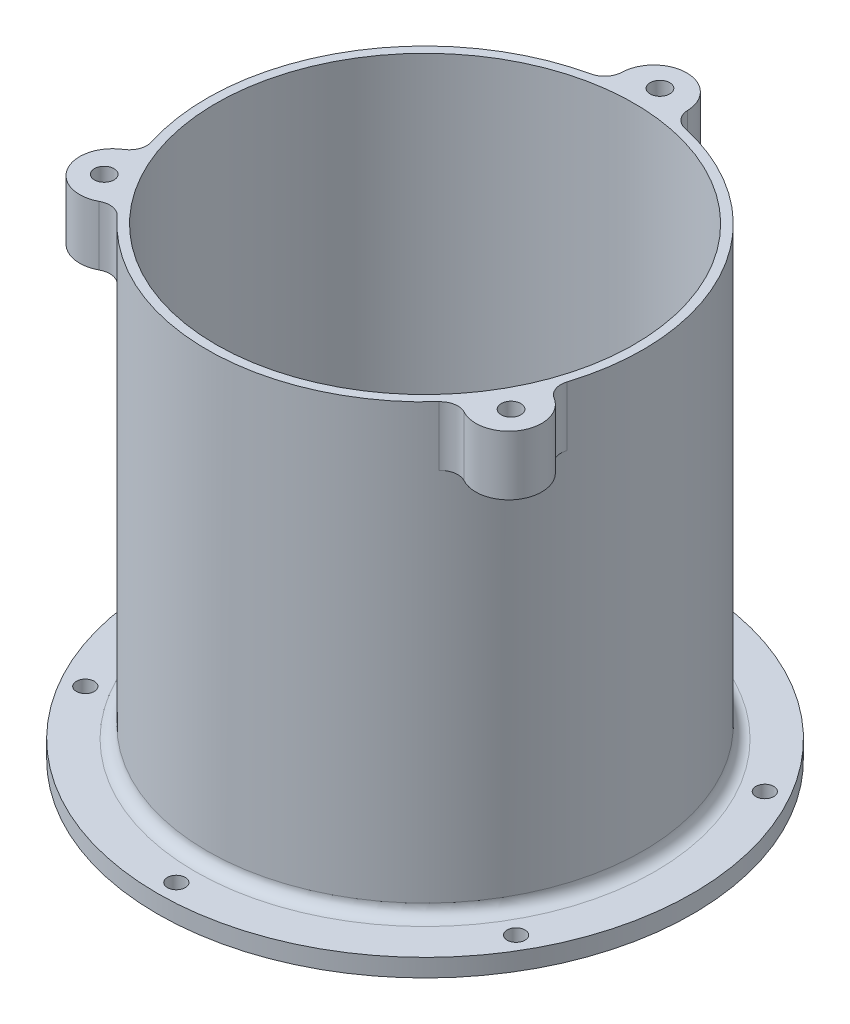
ISO-10303-21;
HEADER;
FILE_DESCRIPTION(('STEP AP214'),'2;1');
FILE_NAME('part.step','',(''),(''),'','','');
FILE_SCHEMA(('AUTOMOTIVE_DESIGN { 1 0 10303 214 1 1 1 1 }'));
ENDSEC;
DATA;
#1=APPLICATION_CONTEXT('core data for automotive mechanical design processes');
#2=APPLICATION_PROTOCOL_DEFINITION('international standard','automotive_design',2000,#1);
#3=PRODUCT_CONTEXT('',#1,'mechanical');
#4=PRODUCT('Part','Part','',(#3));
#5=PRODUCT_RELATED_PRODUCT_CATEGORY('part','',(#4));
#6=PRODUCT_DEFINITION_FORMATION('','',#4);
#7=PRODUCT_DEFINITION_CONTEXT('part definition',#1,'design');
#8=PRODUCT_DEFINITION('design','',#6,#7);
#9=PRODUCT_DEFINITION_SHAPE('','',#8);
#10=(LENGTH_UNIT() NAMED_UNIT(*) SI_UNIT(.MILLI.,.METRE.));
#11=(NAMED_UNIT(*) PLANE_ANGLE_UNIT() SI_UNIT($,.RADIAN.));
#12=(NAMED_UNIT(*) SI_UNIT($,.STERADIAN.) SOLID_ANGLE_UNIT());
#13=UNCERTAINTY_MEASURE_WITH_UNIT(LENGTH_MEASURE(1.E-05),#10,'distance_accuracy_value','');
#14=(GEOMETRIC_REPRESENTATION_CONTEXT(3) GLOBAL_UNCERTAINTY_ASSIGNED_CONTEXT((#13)) GLOBAL_UNIT_ASSIGNED_CONTEXT((#10,
#11,#12)) REPRESENTATION_CONTEXT('',''));
#15=CARTESIAN_POINT('',(0.,0.,0.));
#16=DIRECTION('',(0.,0.,1.));
#17=DIRECTION('',(1.,0.,0.));
#18=AXIS2_PLACEMENT_3D('',#15,#16,#17);
#19=CARTESIAN_POINT('',(0.,78.,0.));
#20=DIRECTION('',(0.,-1.,0.));
#21=DIRECTION('',(0.,0.,-1.));
#22=AXIS2_PLACEMENT_3D('',#19,#20,#21);
#23=CYLINDRICAL_SURFACE('',#22,36.65);
#24=CARTESIAN_POINT('',(0.,5.,0.));
#25=DIRECTION('',(0.,1.,0.));
#26=DIRECTION('',(0.,0.,1.));
#27=AXIS2_PLACEMENT_3D('',#24,#25,#26);
#28=CIRCLE('',#27,36.65);
#29=CARTESIAN_POINT('',(0.,5.,36.65));
#30=VERTEX_POINT('',#29);
#31=EDGE_CURVE('E264',#30,#30,#28,.T.);
#32=ORIENTED_EDGE('',*,*,#31,.T.);
#33=EDGE_LOOP('',(#32));
#34=FACE_BOUND('',#33,.T.);
#35=CARTESIAN_POINT('',(0.,78.,0.));
#36=DIRECTION('',(0.,1.,0.));
#37=DIRECTION('',(0.,0.,1.));
#38=AXIS2_PLACEMENT_3D('',#35,#36,#37);
#39=CIRCLE('',#38,36.65);
#40=CARTESIAN_POINT('',(-7.89335976646149,78.,-35.789906001514));
#41=VERTEX_POINT('',#40);
#42=CARTESIAN_POINT('',(-34.9416476795991,78.,11.059102921791));
#43=VERTEX_POINT('',#42);
#44=EDGE_CURVE('E254',#41,#43,#39,.T.);
#45=ORIENTED_EDGE('',*,*,#44,.F.);
#46=DIRECTION('',(0.,-1.,0.));
#47=VECTOR('',#46,1.);
#48=CARTESIAN_POINT('',(-7.89335976646149,78.,-35.789906001514));
#49=LINE('',#48,#47);
#50=CARTESIAN_POINT('',(-7.89335976646149,68.,-35.789906001514));
#51=VERTEX_POINT('',#50);
#52=EDGE_CURVE('E167',#41,#51,#49,.T.);
#53=ORIENTED_EDGE('',*,*,#52,.T.);
#54=CARTESIAN_POINT('',(0.,68.,0.));
#55=DIRECTION('',(0.,1.,0.));
#56=DIRECTION('',(0.,0.,1.));
#57=AXIS2_PLACEMENT_3D('',#54,#55,#56);
#58=CIRCLE('',#57,36.65);
#59=CARTESIAN_POINT('',(7.89335976646148,68.,-35.789906001514));
#60=VERTEX_POINT('',#59);
#61=EDGE_CURVE('E195',#60,#51,#58,.T.);
#62=ORIENTED_EDGE('',*,*,#61,.F.);
#63=DIRECTION('',(0.,-1.,0.));
#64=VECTOR('',#63,1.);
#65=CARTESIAN_POINT('',(7.89335976646148,78.,-35.789906001514));
#66=LINE('',#65,#64);
#67=CARTESIAN_POINT('',(7.89335976646148,78.,-35.789906001514));
#68=VERTEX_POINT('',#67);
#69=EDGE_CURVE('E281',#60,#68,#66,.F.);
#70=ORIENTED_EDGE('',*,*,#69,.T.);
#71=CARTESIAN_POINT('',(34.941647679599,78.,11.0591029217915));
#72=VERTEX_POINT('',#71);
#73=EDGE_CURVE('E256',#72,#68,#39,.T.);
#74=ORIENTED_EDGE('',*,*,#73,.F.);
#75=DIRECTION('',(0.,-1.,0.));
#76=VECTOR('',#75,1.);
#77=CARTESIAN_POINT('',(34.941647679599,78.,11.0591029217915));
#78=LINE('',#77,#76);
#79=CARTESIAN_POINT('',(34.941647679599,68.,11.0591029217915));
#80=VERTEX_POINT('',#79);
#81=EDGE_CURVE('E284',#72,#80,#78,.T.);
#82=ORIENTED_EDGE('',*,*,#81,.T.);
#83=CARTESIAN_POINT('',(0.,68.,0.));
#84=DIRECTION('',(0.,1.,0.));
#85=DIRECTION('',(0.,0.,1.));
#86=AXIS2_PLACEMENT_3D('',#83,#84,#85);
#87=CIRCLE('',#86,36.65);
#88=CARTESIAN_POINT('',(27.0482879131374,68.,24.7308030797228));
#89=VERTEX_POINT('',#88);
#90=EDGE_CURVE('E207',#89,#80,#87,.T.);
#91=ORIENTED_EDGE('',*,*,#90,.F.);
#92=DIRECTION('',(0.,-1.,0.));
#93=VECTOR('',#92,1.);
#94=CARTESIAN_POINT('',(27.0482879131374,78.,24.7308030797228));
#95=LINE('',#94,#93);
#96=CARTESIAN_POINT('',(27.0482879131374,78.,24.7308030797228));
#97=VERTEX_POINT('',#96);
#98=EDGE_CURVE('E275',#89,#97,#95,.F.);
#99=ORIENTED_EDGE('',*,*,#98,.T.);
#100=CARTESIAN_POINT('',(-27.0482879131377,78.,24.7308030797224));
#101=VERTEX_POINT('',#100);
#102=EDGE_CURVE('E253',#101,#97,#39,.T.);
#103=ORIENTED_EDGE('',*,*,#102,.F.);
#104=DIRECTION('',(0.,-1.,0.));
#105=VECTOR('',#104,1.);
#106=CARTESIAN_POINT('',(-27.0482879131377,78.,24.7308030797224));
#107=LINE('',#106,#105);
#108=CARTESIAN_POINT('',(-27.0482879131377,68.,24.7308030797224));
#109=VERTEX_POINT('',#108);
#110=EDGE_CURVE('E278',#101,#109,#107,.T.);
#111=ORIENTED_EDGE('',*,*,#110,.T.);
#112=CARTESIAN_POINT('',(0.,68.,0.));
#113=DIRECTION('',(0.,1.,0.));
#114=DIRECTION('',(0.,0.,1.));
#115=AXIS2_PLACEMENT_3D('',#112,#113,#114);
#116=CIRCLE('',#115,36.65);
#117=CARTESIAN_POINT('',(-34.9416476795991,68.,11.059102921791));
#118=VERTEX_POINT('',#117);
#119=EDGE_CURVE('E191',#118,#109,#116,.T.);
#120=ORIENTED_EDGE('',*,*,#119,.F.);
#121=DIRECTION('',(0.,-1.,0.));
#122=VECTOR('',#121,1.);
#123=CARTESIAN_POINT('',(-34.9416476795991,78.,11.059102921791));
#124=LINE('',#123,#122);
#125=EDGE_CURVE('E183',#118,#43,#124,.F.);
#126=ORIENTED_EDGE('',*,*,#125,.T.);
#127=EDGE_LOOP('',(#45,#53,#62,#70,#74,#82,#91,#99,#103,#111,#120,#126));
#128=FACE_BOUND('',#127,.T.);
#129=ADVANCED_FACE('F71',(#34,#128),#23,.T.);
#130=CARTESIAN_POINT('',(0.,3.,0.));
#131=DIRECTION('',(0.,1.,0.));
#132=DIRECTION('',(0.,0.,1.));
#133=AXIS2_PLACEMENT_3D('',#130,#131,#132);
#134=PLANE('',#133);
#135=CARTESIAN_POINT('',(0.,3.,-41.825));
#136=DIRECTION('',(0.,1.,0.));
#137=DIRECTION('',(0.,0.,1.));
#138=AXIS2_PLACEMENT_3D('',#135,#136,#137);
#139=CIRCLE('',#138,1.5);
#140=CARTESIAN_POINT('',(0.,3.,-40.325));
#141=VERTEX_POINT('',#140);
#142=EDGE_CURVE('E219',#141,#141,#139,.T.);
#143=ORIENTED_EDGE('',*,*,#142,.F.);
#144=EDGE_LOOP('',(#143));
#145=FACE_BOUND('',#144,.T.);
#146=CARTESIAN_POINT('',(-36.221512513283,3.,-20.9124999999979));
#147=DIRECTION('',(0.,1.,0.));
#148=DIRECTION('',(0.,0.,1.));
#149=AXIS2_PLACEMENT_3D('',#146,#147,#148);
#150=CIRCLE('',#149,1.50000000000223);
#151=CARTESIAN_POINT('',(-36.221512513283,3.,-19.4124999999957));
#152=VERTEX_POINT('',#151);
#153=EDGE_CURVE('E209',#152,#152,#150,.T.);
#154=ORIENTED_EDGE('',*,*,#153,.F.);
#155=EDGE_LOOP('',(#154));
#156=FACE_BOUND('',#155,.T.);
#157=CARTESIAN_POINT('',(-36.2215125132806,3.,20.9125000000021));
#158=DIRECTION('',(0.,1.,0.));
#159=DIRECTION('',(0.,0.,1.));
#160=AXIS2_PLACEMENT_3D('',#157,#158,#159);
#161=CIRCLE('',#160,1.50000000000439);
#162=CARTESIAN_POINT('',(-36.2215125132806,3.,22.4125000000065));
#163=VERTEX_POINT('',#162);
#164=EDGE_CURVE('E226',#163,#163,#161,.T.);
#165=ORIENTED_EDGE('',*,*,#164,.F.);
#166=EDGE_LOOP('',(#165));
#167=FACE_BOUND('',#166,.T.);
#168=CARTESIAN_POINT('',(4.74470781723172E-12,3.,41.825));
#169=DIRECTION('',(0.,1.,0.));
#170=DIRECTION('',(0.,0.,1.));
#171=AXIS2_PLACEMENT_3D('',#168,#169,#170);
#172=CIRCLE('',#171,1.50000000000482);
#173=CARTESIAN_POINT('',(4.74470781723172E-12,3.,43.3250000000048));
#174=VERTEX_POINT('',#173);
#175=EDGE_CURVE('E243',#174,#174,#172,.T.);
#176=ORIENTED_EDGE('',*,*,#175,.F.);
#177=EDGE_LOOP('',(#176));
#178=FACE_BOUND('',#177,.T.);
#179=CARTESIAN_POINT('',(36.2215125132877,3.,20.9124999999979));
#180=DIRECTION('',(0.,1.,0.));
#181=DIRECTION('',(0.,0.,1.));
#182=AXIS2_PLACEMENT_3D('',#179,#180,#181);
#183=CIRCLE('',#182,1.50000000000301);
#184=CARTESIAN_POINT('',(36.2215125132877,3.,22.4125000000009));
#185=VERTEX_POINT('',#184);
#186=EDGE_CURVE('E237',#185,#185,#183,.T.);
#187=ORIENTED_EDGE('',*,*,#186,.F.);
#188=EDGE_LOOP('',(#187));
#189=FACE_BOUND('',#188,.T.);
#190=CARTESIAN_POINT('',(36.2215125132853,3.,-20.9125000000021));
#191=DIRECTION('',(0.,1.,0.));
#192=DIRECTION('',(0.,0.,1.));
#193=AXIS2_PLACEMENT_3D('',#190,#191,#192);
#194=CIRCLE('',#193,1.50000000000063);
#195=CARTESIAN_POINT('',(36.2215125132853,3.,-19.4125000000014));
#196=VERTEX_POINT('',#195);
#197=EDGE_CURVE('E231',#196,#196,#194,.T.);
#198=ORIENTED_EDGE('',*,*,#197,.F.);
#199=EDGE_LOOP('',(#198));
#200=FACE_BOUND('',#199,.T.);
#201=CARTESIAN_POINT('',(0.,3.,0.));
#202=DIRECTION('',(0.,1.,0.));
#203=DIRECTION('',(0.,0.,1.));
#204=AXIS2_PLACEMENT_3D('',#201,#202,#203);
#205=CIRCLE('',#204,38.65);
#206=CARTESIAN_POINT('',(0.,3.,38.65));
#207=VERTEX_POINT('',#206);
#208=EDGE_CURVE('E269',#207,#207,#205,.F.);
#209=ORIENTED_EDGE('',*,*,#208,.T.);
#210=EDGE_LOOP('',(#209));
#211=FACE_BOUND('',#210,.T.);
#212=CARTESIAN_POINT('',(0.,3.,0.));
#213=DIRECTION('',(0.,1.,0.));
#214=DIRECTION('',(0.,0.,1.));
#215=AXIS2_PLACEMENT_3D('',#212,#213,#214);
#216=CIRCLE('',#215,45.);
#217=CARTESIAN_POINT('',(0.,3.,45.));
#218=VERTEX_POINT('',#217);
#219=EDGE_CURVE('E261',#218,#218,#216,.T.);
#220=ORIENTED_EDGE('',*,*,#219,.T.);
#221=EDGE_LOOP('',(#220));
#222=FACE_BOUND('',#221,.T.);
#223=ADVANCED_FACE('F350',(#145,#156,#167,#178,#189,#200,#211,#222),#134,.T.);
#224=CARTESIAN_POINT('',(0.,0.,0.));
#225=DIRECTION('',(0.,1.,0.));
#226=DIRECTION('',(0.,0.,1.));
#227=AXIS2_PLACEMENT_3D('',#224,#225,#226);
#228=PLANE('',#227);
#229=CARTESIAN_POINT('',(0.,0.,-41.825));
#230=DIRECTION('',(0.,1.,0.));
#231=DIRECTION('',(0.,0.,1.));
#232=AXIS2_PLACEMENT_3D('',#229,#230,#231);
#233=CIRCLE('',#232,1.5);
#234=CARTESIAN_POINT('',(0.,0.,-40.325));
#235=VERTEX_POINT('',#234);
#236=EDGE_CURVE('E215',#235,#235,#233,.T.);
#237=ORIENTED_EDGE('',*,*,#236,.T.);
#238=EDGE_LOOP('',(#237));
#239=FACE_BOUND('',#238,.T.);
#240=CARTESIAN_POINT('',(-36.221512513283,0.,-20.9124999999979));
#241=DIRECTION('',(0.,1.,0.));
#242=DIRECTION('',(0.,0.,1.));
#243=AXIS2_PLACEMENT_3D('',#240,#241,#242);
#244=CIRCLE('',#243,1.50000000000223);
#245=CARTESIAN_POINT('',(-36.221512513283,0.,-19.4124999999957));
#246=VERTEX_POINT('',#245);
#247=EDGE_CURVE('E223',#246,#246,#244,.T.);
#248=ORIENTED_EDGE('',*,*,#247,.T.);
#249=EDGE_LOOP('',(#248));
#250=FACE_BOUND('',#249,.T.);
#251=CARTESIAN_POINT('',(-36.2215125132806,0.,20.9125000000021));
#252=DIRECTION('',(0.,1.,0.));
#253=DIRECTION('',(0.,0.,1.));
#254=AXIS2_PLACEMENT_3D('',#251,#252,#253);
#255=CIRCLE('',#254,1.50000000000439);
#256=CARTESIAN_POINT('',(-36.2215125132806,0.,22.4125000000065));
#257=VERTEX_POINT('',#256);
#258=EDGE_CURVE('E246',#257,#257,#255,.T.);
#259=ORIENTED_EDGE('',*,*,#258,.T.);
#260=EDGE_LOOP('',(#259));
#261=FACE_BOUND('',#260,.T.);
#262=CARTESIAN_POINT('',(4.74470781723172E-12,0.,41.825));
#263=DIRECTION('',(0.,1.,0.));
#264=DIRECTION('',(0.,0.,1.));
#265=AXIS2_PLACEMENT_3D('',#262,#263,#264);
#266=CIRCLE('',#265,1.50000000000482);
#267=CARTESIAN_POINT('',(4.74470781723172E-12,0.,43.3250000000048));
#268=VERTEX_POINT('',#267);
#269=EDGE_CURVE('E240',#268,#268,#266,.T.);
#270=ORIENTED_EDGE('',*,*,#269,.T.);
#271=EDGE_LOOP('',(#270));
#272=FACE_BOUND('',#271,.T.);
#273=CARTESIAN_POINT('',(36.2215125132877,0.,20.9124999999979));
#274=DIRECTION('',(0.,1.,0.));
#275=DIRECTION('',(0.,0.,1.));
#276=AXIS2_PLACEMENT_3D('',#273,#274,#275);
#277=CIRCLE('',#276,1.50000000000301);
#278=CARTESIAN_POINT('',(36.2215125132877,0.,22.4125000000009));
#279=VERTEX_POINT('',#278);
#280=EDGE_CURVE('E234',#279,#279,#277,.T.);
#281=ORIENTED_EDGE('',*,*,#280,.T.);
#282=EDGE_LOOP('',(#281));
#283=FACE_BOUND('',#282,.T.);
#284=CARTESIAN_POINT('',(36.2215125132853,0.,-20.9125000000021));
#285=DIRECTION('',(0.,1.,0.));
#286=DIRECTION('',(0.,0.,1.));
#287=AXIS2_PLACEMENT_3D('',#284,#285,#286);
#288=CIRCLE('',#287,1.50000000000063);
#289=CARTESIAN_POINT('',(36.2215125132853,0.,-19.4125000000014));
#290=VERTEX_POINT('',#289);
#291=EDGE_CURVE('E222',#290,#290,#288,.T.);
#292=ORIENTED_EDGE('',*,*,#291,.T.);
#293=EDGE_LOOP('',(#292));
#294=FACE_BOUND('',#293,.T.);
#295=CARTESIAN_POINT('',(0.,0.,0.));
#296=DIRECTION('',(0.,1.,0.));
#297=DIRECTION('',(0.,0.,1.));
#298=AXIS2_PLACEMENT_3D('',#295,#296,#297);
#299=CIRCLE('',#298,45.);
#300=CARTESIAN_POINT('',(0.,0.,45.));
#301=VERTEX_POINT('',#300);
#302=EDGE_CURVE('E260',#301,#301,#299,.T.);
#303=ORIENTED_EDGE('',*,*,#302,.F.);
#304=EDGE_LOOP('',(#303));
#305=FACE_BOUND('',#304,.T.);
#306=CARTESIAN_POINT('',(0.,0.,0.));
#307=DIRECTION('',(0.,1.,0.));
#308=DIRECTION('',(0.,0.,1.));
#309=AXIS2_PLACEMENT_3D('',#306,#307,#308);
#310=CIRCLE('',#309,35.15);
#311=CARTESIAN_POINT('',(0.,0.,35.15));
#312=VERTEX_POINT('',#311);
#313=EDGE_CURVE('E257',#312,#312,#310,.T.);
#314=ORIENTED_EDGE('',*,*,#313,.T.);
#315=EDGE_LOOP('',(#314));
#316=FACE_BOUND('',#315,.T.);
#317=ADVANCED_FACE('F358',(#239,#250,#261,#272,#283,#294,#305,#316),#228,.F.);
#318=CARTESIAN_POINT('',(0.,3.,0.));
#319=DIRECTION('',(0.,-1.,0.));
#320=DIRECTION('',(0.,0.,-1.));
#321=AXIS2_PLACEMENT_3D('',#318,#319,#320);
#322=CYLINDRICAL_SURFACE('',#321,45.);
#323=ORIENTED_EDGE('',*,*,#219,.F.);
#324=EDGE_LOOP('',(#323));
#325=FACE_BOUND('',#324,.T.);
#326=ORIENTED_EDGE('',*,*,#302,.T.);
#327=EDGE_LOOP('',(#326));
#328=FACE_BOUND('',#327,.T.);
#329=ADVANCED_FACE('F366',(#325,#328),#322,.T.);
#330=CARTESIAN_POINT('',(0.,3.,0.));
#331=DIRECTION('',(0.,-1.,0.));
#332=DIRECTION('',(0.,0.,-1.));
#333=AXIS2_PLACEMENT_3D('',#330,#331,#332);
#334=CYLINDRICAL_SURFACE('',#333,35.15);
#335=ORIENTED_EDGE('',*,*,#313,.F.);
#336=EDGE_LOOP('',(#335));
#337=FACE_BOUND('',#336,.T.);
#338=CARTESIAN_POINT('',(0.,78.,0.));
#339=DIRECTION('',(0.,1.,0.));
#340=DIRECTION('',(0.,0.,1.));
#341=AXIS2_PLACEMENT_3D('',#338,#339,#340);
#342=CIRCLE('',#341,35.15);
#343=CARTESIAN_POINT('',(0.,78.,35.15));
#344=VERTEX_POINT('',#343);
#345=EDGE_CURVE('E218',#344,#344,#342,.T.);
#346=ORIENTED_EDGE('',*,*,#345,.T.);
#347=EDGE_LOOP('',(#346));
#348=FACE_BOUND('',#347,.T.);
#349=ADVANCED_FACE('F364',(#337,#348),#334,.F.);
#350=CARTESIAN_POINT('',(0.,78.,0.));
#351=DIRECTION('',(0.,1.,0.));
#352=DIRECTION('',(0.,0.,1.));
#353=AXIS2_PLACEMENT_3D('',#350,#351,#352);
#354=PLANE('',#353);
#355=CARTESIAN_POINT('',(0.,78.,-39.5));
#356=DIRECTION('',(0.,1.,0.));
#357=DIRECTION('',(0.,0.,1.));
#358=AXIS2_PLACEMENT_3D('',#355,#356,#357);
#359=CIRCLE('',#358,1.65);
#360=CARTESIAN_POINT('',(0.,78.,-37.85));
#361=VERTEX_POINT('',#360);
#362=EDGE_CURVE('E463',#361,#361,#359,.T.);
#363=ORIENTED_EDGE('',*,*,#362,.F.);
#364=EDGE_LOOP('',(#363));
#365=FACE_BOUND('',#364,.T.);
#366=CARTESIAN_POINT('',(34.2080034494869,78.,19.7499999999991));
#367=DIRECTION('',(0.,1.,0.));
#368=DIRECTION('',(0.,0.,1.));
#369=AXIS2_PLACEMENT_3D('',#366,#367,#368);
#370=CIRCLE('',#369,1.65);
#371=CARTESIAN_POINT('',(34.2080034494869,78.,21.3999999999991));
#372=VERTEX_POINT('',#371);
#373=EDGE_CURVE('E467',#372,#372,#370,.T.);
#374=ORIENTED_EDGE('',*,*,#373,.F.);
#375=EDGE_LOOP('',(#374));
#376=FACE_BOUND('',#375,.T.);
#377=CARTESIAN_POINT('',(-34.2080034494837,78.,19.7500000000009));
#378=DIRECTION('',(0.,1.,0.));
#379=DIRECTION('',(0.,0.,1.));
#380=AXIS2_PLACEMENT_3D('',#377,#378,#379);
#381=CIRCLE('',#380,1.65);
#382=CARTESIAN_POINT('',(-34.2080034494837,78.,21.4000000000009));
#383=VERTEX_POINT('',#382);
#384=EDGE_CURVE('E198',#383,#383,#381,.T.);
#385=ORIENTED_EDGE('',*,*,#384,.F.);
#386=EDGE_LOOP('',(#385));
#387=FACE_BOUND('',#386,.T.);
#388=CARTESIAN_POINT('',(33.3106548429465,78.,19.2319155404581));
#389=DIRECTION('',(0.,-1.,0.));
#390=DIRECTION('',(0.,0.,-1.));
#391=AXIS2_PLACEMENT_3D('',#388,#389,#390);
#392=CIRCLE('',#391,5.54330034178372);
#393=CARTESIAN_POINT('',(36.2247302017688,78.,14.5163727846001));
#394=VERTEX_POINT('',#393);
#395=CARTESIAN_POINT('',(30.683912703153,78.,24.1133502076694));
#396=VERTEX_POINT('',#395);
#397=EDGE_CURVE('E205',#394,#396,#392,.T.);
#398=ORIENTED_EDGE('',*,*,#397,.F.);
#399=CARTESIAN_POINT('',(37.8018098361828,78.,11.9643500913788));
#400=DIRECTION('',(0.,1.,0.));
#401=DIRECTION('',(0.,0.,1.));
#402=AXIS2_PLACEMENT_3D('',#399,#400,#401);
#403=CIRCLE('',#402,3.);
#404=EDGE_CURVE('E297',#394,#72,#403,.F.);
#405=ORIENTED_EDGE('',*,*,#404,.T.);
#406=ORIENTED_EDGE('',*,*,#73,.T.);
#407=CARTESIAN_POINT('',(8.53947379918684,78.,-38.7195026728521));
#408=DIRECTION('',(0.,1.,0.));
#409=DIRECTION('',(0.,0.,1.));
#410=AXIS2_PLACEMENT_3D('',#407,#408,#409);
#411=CIRCLE('',#410,3.);
#412=CARTESIAN_POINT('',(5.5408174986158,78.,-38.6297229922692));
#413=VERTEX_POINT('',#412);
#414=EDGE_CURVE('E190',#68,#413,#411,.F.);
#415=ORIENTED_EDGE('',*,*,#414,.T.);
#416=CARTESIAN_POINT('',(0.,78.,-38.4638310809158));
#417=DIRECTION('',(0.,-1.,0.));
#418=DIRECTION('',(0.,0.,-1.));
#419=AXIS2_PLACEMENT_3D('',#416,#417,#418);
#420=CIRCLE('',#419,5.54330034178372);
#421=CARTESIAN_POINT('',(-5.5408174986158,78.,-38.6297229922692));
#422=VERTEX_POINT('',#421);
#423=EDGE_CURVE('E179',#422,#413,#420,.T.);
#424=ORIENTED_EDGE('',*,*,#423,.F.);
#425=CARTESIAN_POINT('',(-8.53947379918685,78.,-38.7195026728521));
#426=DIRECTION('',(0.,1.,0.));
#427=DIRECTION('',(0.,0.,1.));
#428=AXIS2_PLACEMENT_3D('',#425,#426,#427);
#429=CIRCLE('',#428,3.);
#430=EDGE_CURVE('E161',#422,#41,#429,.F.);
#431=ORIENTED_EDGE('',*,*,#430,.T.);
#432=ORIENTED_EDGE('',*,*,#44,.T.);
#433=CARTESIAN_POINT('',(-37.8018098361829,78.,11.9643500913783));
#434=DIRECTION('',(0.,1.,0.));
#435=DIRECTION('',(0.,0.,1.));
#436=AXIS2_PLACEMENT_3D('',#433,#434,#435);
#437=CIRCLE('',#436,3.);
#438=CARTESIAN_POINT('',(-36.224730201769,78.,14.5163727845997));
#439=VERTEX_POINT('',#438);
#440=EDGE_CURVE('E79',#43,#439,#437,.F.);
#441=ORIENTED_EDGE('',*,*,#440,.T.);
#442=CARTESIAN_POINT('',(-33.3106548429467,78.,19.2319155404576));
#443=DIRECTION('',(0.,-1.,0.));
#444=DIRECTION('',(0.,0.,-1.));
#445=AXIS2_PLACEMENT_3D('',#442,#443,#444);
#446=CIRCLE('',#445,5.54330034178372);
#447=CARTESIAN_POINT('',(-30.6839127031533,78.,24.113350207669));
#448=VERTEX_POINT('',#447);
#449=EDGE_CURVE('E203',#448,#439,#446,.T.);
#450=ORIENTED_EDGE('',*,*,#449,.F.);
#451=CARTESIAN_POINT('',(-29.2623360369962,78.,26.7551525814732));
#452=DIRECTION('',(0.,1.,0.));
#453=DIRECTION('',(0.,0.,1.));
#454=AXIS2_PLACEMENT_3D('',#451,#452,#453);
#455=CIRCLE('',#454,3.);
#456=EDGE_CURVE('E305',#448,#101,#455,.F.);
#457=ORIENTED_EDGE('',*,*,#456,.T.);
#458=ORIENTED_EDGE('',*,*,#102,.T.);
#459=CARTESIAN_POINT('',(29.2623360369959,78.,26.7551525814736));
#460=DIRECTION('',(0.,1.,0.));
#461=DIRECTION('',(0.,0.,1.));
#462=AXIS2_PLACEMENT_3D('',#459,#460,#461);
#463=CIRCLE('',#462,3.);
#464=EDGE_CURVE('E308',#97,#396,#463,.F.);
#465=ORIENTED_EDGE('',*,*,#464,.T.);
#466=EDGE_LOOP('',(#398,#405,#406,#415,#424,#431,#432,#441,#450,#457,#458,#465));
#467=FACE_BOUND('',#466,.T.);
#468=ORIENTED_EDGE('',*,*,#345,.F.);
#469=EDGE_LOOP('',(#468));
#470=FACE_BOUND('',#469,.T.);
#471=ADVANCED_FACE('F187',(#365,#376,#387,#467,#470),#354,.T.);
#472=CARTESIAN_POINT('',(0.,5.,0.));
#473=DIRECTION('',(0.,1.,0.));
#474=DIRECTION('',(0.,0.,1.));
#475=AXIS2_PLACEMENT_3D('',#472,#473,#474);
#476=TOROIDAL_SURFACE('',#475,38.65,2.);
#477=ORIENTED_EDGE('',*,*,#208,.F.);
#478=EDGE_LOOP('',(#477));
#479=FACE_BOUND('',#478,.T.);
#480=ORIENTED_EDGE('',*,*,#31,.F.);
#481=EDGE_LOOP('',(#480));
#482=FACE_BOUND('',#481,.T.);
#483=ADVANCED_FACE('F375',(#479,#482),#476,.F.);
#484=CARTESIAN_POINT('',(36.2215125132853,0.,-20.9125000000021));
#485=DIRECTION('',(0.,1.,0.));
#486=DIRECTION('',(0.,0.,1.));
#487=AXIS2_PLACEMENT_3D('',#484,#485,#486);
#488=CYLINDRICAL_SURFACE('',#487,1.50000000000063);
#489=ORIENTED_EDGE('',*,*,#291,.F.);
#490=EDGE_LOOP('',(#489));
#491=FACE_BOUND('',#490,.T.);
#492=ORIENTED_EDGE('',*,*,#197,.T.);
#493=EDGE_LOOP('',(#492));
#494=FACE_BOUND('',#493,.T.);
#495=ADVANCED_FACE('F378',(#491,#494),#488,.F.);
#496=CARTESIAN_POINT('',(36.2215125132877,0.,20.9124999999979));
#497=DIRECTION('',(0.,1.,0.));
#498=DIRECTION('',(0.,0.,1.));
#499=AXIS2_PLACEMENT_3D('',#496,#497,#498);
#500=CYLINDRICAL_SURFACE('',#499,1.50000000000301);
#501=ORIENTED_EDGE('',*,*,#280,.F.);
#502=EDGE_LOOP('',(#501));
#503=FACE_BOUND('',#502,.T.);
#504=ORIENTED_EDGE('',*,*,#186,.T.);
#505=EDGE_LOOP('',(#504));
#506=FACE_BOUND('',#505,.T.);
#507=ADVANCED_FACE('F424',(#503,#506),#500,.F.);
#508=CARTESIAN_POINT('',(4.74470781723172E-12,0.,41.825));
#509=DIRECTION('',(0.,1.,0.));
#510=DIRECTION('',(0.,0.,1.));
#511=AXIS2_PLACEMENT_3D('',#508,#509,#510);
#512=CYLINDRICAL_SURFACE('',#511,1.50000000000482);
#513=ORIENTED_EDGE('',*,*,#269,.F.);
#514=EDGE_LOOP('',(#513));
#515=FACE_BOUND('',#514,.T.);
#516=ORIENTED_EDGE('',*,*,#175,.T.);
#517=EDGE_LOOP('',(#516));
#518=FACE_BOUND('',#517,.T.);
#519=ADVANCED_FACE('F428',(#515,#518),#512,.F.);
#520=CARTESIAN_POINT('',(-36.2215125132806,0.,20.9125000000021));
#521=DIRECTION('',(0.,1.,0.));
#522=DIRECTION('',(0.,0.,1.));
#523=AXIS2_PLACEMENT_3D('',#520,#521,#522);
#524=CYLINDRICAL_SURFACE('',#523,1.50000000000439);
#525=ORIENTED_EDGE('',*,*,#258,.F.);
#526=EDGE_LOOP('',(#525));
#527=FACE_BOUND('',#526,.T.);
#528=ORIENTED_EDGE('',*,*,#164,.T.);
#529=EDGE_LOOP('',(#528));
#530=FACE_BOUND('',#529,.T.);
#531=ADVANCED_FACE('F420',(#527,#530),#524,.F.);
#532=CARTESIAN_POINT('',(-36.221512513283,0.,-20.9124999999979));
#533=DIRECTION('',(0.,1.,0.));
#534=DIRECTION('',(0.,0.,1.));
#535=AXIS2_PLACEMENT_3D('',#532,#533,#534);
#536=CYLINDRICAL_SURFACE('',#535,1.50000000000223);
#537=ORIENTED_EDGE('',*,*,#247,.F.);
#538=EDGE_LOOP('',(#537));
#539=FACE_BOUND('',#538,.T.);
#540=ORIENTED_EDGE('',*,*,#153,.T.);
#541=EDGE_LOOP('',(#540));
#542=FACE_BOUND('',#541,.T.);
#543=ADVANCED_FACE('F416',(#539,#542),#536,.F.);
#544=CARTESIAN_POINT('',(0.,0.,-41.825));
#545=DIRECTION('',(0.,1.,0.));
#546=DIRECTION('',(0.,0.,1.));
#547=AXIS2_PLACEMENT_3D('',#544,#545,#546);
#548=CYLINDRICAL_SURFACE('',#547,1.5);
#549=ORIENTED_EDGE('',*,*,#236,.F.);
#550=EDGE_LOOP('',(#549));
#551=FACE_BOUND('',#550,.T.);
#552=ORIENTED_EDGE('',*,*,#142,.T.);
#553=EDGE_LOOP('',(#552));
#554=FACE_BOUND('',#553,.T.);
#555=ADVANCED_FACE('F410',(#551,#554),#548,.F.);
#556=CARTESIAN_POINT('',(0.,68.,0.));
#557=DIRECTION('',(0.,1.,0.));
#558=DIRECTION('',(0.,0.,1.));
#559=AXIS2_PLACEMENT_3D('',#556,#557,#558);
#560=PLANE('',#559);
#561=CARTESIAN_POINT('',(34.2080034494869,68.,19.7499999999991));
#562=DIRECTION('',(0.,1.,0.));
#563=DIRECTION('',(0.,0.,1.));
#564=AXIS2_PLACEMENT_3D('',#561,#562,#563);
#565=CIRCLE('',#564,1.65);
#566=CARTESIAN_POINT('',(34.2080034494869,68.,21.3999999999991));
#567=VERTEX_POINT('',#566);
#568=EDGE_CURVE('E474',#567,#567,#565,.T.);
#569=ORIENTED_EDGE('',*,*,#568,.T.);
#570=EDGE_LOOP('',(#569));
#571=FACE_BOUND('',#570,.T.);
#572=ORIENTED_EDGE('',*,*,#90,.T.);
#573=CARTESIAN_POINT('',(37.8018098361828,68.,11.9643500913788));
#574=DIRECTION('',(0.,1.,0.));
#575=DIRECTION('',(0.,0.,1.));
#576=AXIS2_PLACEMENT_3D('',#573,#574,#575);
#577=CIRCLE('',#576,3.);
#578=CARTESIAN_POINT('',(36.2247302017688,68.,14.5163727846001));
#579=VERTEX_POINT('',#578);
#580=EDGE_CURVE('E299',#80,#579,#577,.T.);
#581=ORIENTED_EDGE('',*,*,#580,.T.);
#582=CARTESIAN_POINT('',(33.3106548429465,68.,19.2319155404581));
#583=DIRECTION('',(0.,-1.,0.));
#584=DIRECTION('',(0.,0.,-1.));
#585=AXIS2_PLACEMENT_3D('',#582,#583,#584);
#586=CIRCLE('',#585,5.54330034178372);
#587=CARTESIAN_POINT('',(30.683912703153,68.,24.1133502076694));
#588=VERTEX_POINT('',#587);
#589=EDGE_CURVE('E210',#579,#588,#586,.T.);
#590=ORIENTED_EDGE('',*,*,#589,.T.);
#591=CARTESIAN_POINT('',(29.2623360369959,68.,26.7551525814736));
#592=DIRECTION('',(0.,1.,0.));
#593=DIRECTION('',(0.,0.,1.));
#594=AXIS2_PLACEMENT_3D('',#591,#592,#593);
#595=CIRCLE('',#594,3.);
#596=EDGE_CURVE('E310',#588,#89,#595,.T.);
#597=ORIENTED_EDGE('',*,*,#596,.T.);
#598=EDGE_LOOP('',(#572,#581,#590,#597));
#599=FACE_BOUND('',#598,.T.);
#600=ADVANCED_FACE('F335',(#571,#599),#560,.F.);
#601=CARTESIAN_POINT('',(33.3106548429465,68.,19.2319155404581));
#602=DIRECTION('',(0.,1.,0.));
#603=DIRECTION('',(0.,0.,1.));
#604=AXIS2_PLACEMENT_3D('',#601,#602,#603);
#605=CYLINDRICAL_SURFACE('',#604,5.54330034178372);
#606=ORIENTED_EDGE('',*,*,#589,.F.);
#607=DIRECTION('',(0.,1.,0.));
#608=VECTOR('',#607,1.);
#609=CARTESIAN_POINT('',(36.2247302017688,68.,14.5163727846001));
#610=LINE('',#609,#608);
#611=EDGE_CURVE('E290',#579,#394,#610,.T.);
#612=ORIENTED_EDGE('',*,*,#611,.T.);
#613=ORIENTED_EDGE('',*,*,#397,.T.);
#614=DIRECTION('',(0.,1.,0.));
#615=VECTOR('',#614,1.);
#616=CARTESIAN_POINT('',(30.683912703153,68.,24.1133502076694));
#617=LINE('',#616,#615);
#618=EDGE_CURVE('E288',#396,#588,#617,.F.);
#619=ORIENTED_EDGE('',*,*,#618,.T.);
#620=EDGE_LOOP('',(#606,#612,#613,#619));
#621=FACE_BOUND('',#620,.T.);
#622=ADVANCED_FACE('F338',(#621),#605,.T.);
#623=CARTESIAN_POINT('',(0.,68.,0.));
#624=DIRECTION('',(0.,1.,0.));
#625=DIRECTION('',(0.,0.,1.));
#626=AXIS2_PLACEMENT_3D('',#623,#624,#625);
#627=PLANE('',#626);
#628=CARTESIAN_POINT('',(-34.2080034494837,68.,19.7500000000009));
#629=DIRECTION('',(0.,1.,0.));
#630=DIRECTION('',(0.,0.,1.));
#631=AXIS2_PLACEMENT_3D('',#628,#629,#630);
#632=CIRCLE('',#631,1.65);
#633=CARTESIAN_POINT('',(-34.2080034494837,68.,21.4000000000009));
#634=VERTEX_POINT('',#633);
#635=EDGE_CURVE('E471',#634,#634,#632,.T.);
#636=ORIENTED_EDGE('',*,*,#635,.T.);
#637=EDGE_LOOP('',(#636));
#638=FACE_BOUND('',#637,.T.);
#639=ORIENTED_EDGE('',*,*,#119,.T.);
#640=CARTESIAN_POINT('',(-29.2623360369962,68.,26.7551525814732));
#641=DIRECTION('',(0.,1.,0.));
#642=DIRECTION('',(0.,0.,1.));
#643=AXIS2_PLACEMENT_3D('',#640,#641,#642);
#644=CIRCLE('',#643,3.);
#645=CARTESIAN_POINT('',(-30.6839127031533,68.,24.113350207669));
#646=VERTEX_POINT('',#645);
#647=EDGE_CURVE('E93',#109,#646,#644,.T.);
#648=ORIENTED_EDGE('',*,*,#647,.T.);
#649=CARTESIAN_POINT('',(-33.3106548429467,68.,19.2319155404576));
#650=DIRECTION('',(0.,-1.,0.));
#651=DIRECTION('',(0.,0.,-1.));
#652=AXIS2_PLACEMENT_3D('',#649,#650,#651);
#653=CIRCLE('',#652,5.54330034178372);
#654=CARTESIAN_POINT('',(-36.224730201769,68.,14.5163727845997));
#655=VERTEX_POINT('',#654);
#656=EDGE_CURVE('E193',#646,#655,#653,.T.);
#657=ORIENTED_EDGE('',*,*,#656,.T.);
#658=CARTESIAN_POINT('',(-37.8018098361829,68.,11.9643500913783));
#659=DIRECTION('',(0.,1.,0.));
#660=DIRECTION('',(0.,0.,1.));
#661=AXIS2_PLACEMENT_3D('',#658,#659,#660);
#662=CIRCLE('',#661,3.);
#663=EDGE_CURVE('E12',#655,#118,#662,.T.);
#664=ORIENTED_EDGE('',*,*,#663,.T.);
#665=EDGE_LOOP('',(#639,#648,#657,#664));
#666=FACE_BOUND('',#665,.T.);
#667=ADVANCED_FACE('F318',(#638,#666),#627,.F.);
#668=CARTESIAN_POINT('',(-33.3106548429467,68.,19.2319155404576));
#669=DIRECTION('',(0.,1.,0.));
#670=DIRECTION('',(0.,0.,1.));
#671=AXIS2_PLACEMENT_3D('',#668,#669,#670);
#672=CYLINDRICAL_SURFACE('',#671,5.54330034178372);
#673=ORIENTED_EDGE('',*,*,#656,.F.);
#674=DIRECTION('',(0.,1.,0.));
#675=VECTOR('',#674,1.);
#676=CARTESIAN_POINT('',(-30.6839127031533,68.,24.113350207669));
#677=LINE('',#676,#675);
#678=EDGE_CURVE('E173',#646,#448,#677,.T.);
#679=ORIENTED_EDGE('',*,*,#678,.T.);
#680=ORIENTED_EDGE('',*,*,#449,.T.);
#681=DIRECTION('',(0.,1.,0.));
#682=VECTOR('',#681,1.);
#683=CARTESIAN_POINT('',(-36.224730201769,68.,14.5163727845997));
#684=LINE('',#683,#682);
#685=EDGE_CURVE('E86',#439,#655,#684,.F.);
#686=ORIENTED_EDGE('',*,*,#685,.T.);
#687=EDGE_LOOP('',(#673,#679,#680,#686));
#688=FACE_BOUND('',#687,.T.);
#689=ADVANCED_FACE('F315',(#688),#672,.T.);
#690=CARTESIAN_POINT('',(0.,68.,0.));
#691=DIRECTION('',(0.,1.,0.));
#692=DIRECTION('',(0.,0.,1.));
#693=AXIS2_PLACEMENT_3D('',#690,#691,#692);
#694=PLANE('',#693);
#695=CARTESIAN_POINT('',(0.,68.,-39.5));
#696=DIRECTION('',(0.,1.,0.));
#697=DIRECTION('',(0.,0.,1.));
#698=AXIS2_PLACEMENT_3D('',#695,#696,#697);
#699=CIRCLE('',#698,1.65);
#700=CARTESIAN_POINT('',(0.,68.,-37.85));
#701=VERTEX_POINT('',#700);
#702=EDGE_CURVE('E202',#701,#701,#699,.T.);
#703=ORIENTED_EDGE('',*,*,#702,.T.);
#704=EDGE_LOOP('',(#703));
#705=FACE_BOUND('',#704,.T.);
#706=ORIENTED_EDGE('',*,*,#61,.T.);
#707=CARTESIAN_POINT('',(-8.53947379918685,68.,-38.7195026728521));
#708=DIRECTION('',(0.,1.,0.));
#709=DIRECTION('',(0.,0.,1.));
#710=AXIS2_PLACEMENT_3D('',#707,#708,#709);
#711=CIRCLE('',#710,3.);
#712=CARTESIAN_POINT('',(-5.5408174986158,68.,-38.6297229922692));
#713=VERTEX_POINT('',#712);
#714=EDGE_CURVE('E172',#51,#713,#711,.T.);
#715=ORIENTED_EDGE('',*,*,#714,.T.);
#716=CARTESIAN_POINT('',(0.,68.,-38.4638310809158));
#717=DIRECTION('',(0.,-1.,0.));
#718=DIRECTION('',(0.,0.,-1.));
#719=AXIS2_PLACEMENT_3D('',#716,#717,#718);
#720=CIRCLE('',#719,5.54330034178372);
#721=CARTESIAN_POINT('',(5.5408174986158,68.,-38.6297229922692));
#722=VERTEX_POINT('',#721);
#723=EDGE_CURVE('E182',#713,#722,#720,.T.);
#724=ORIENTED_EDGE('',*,*,#723,.T.);
#725=CARTESIAN_POINT('',(8.53947379918684,68.,-38.7195026728521));
#726=DIRECTION('',(0.,1.,0.));
#727=DIRECTION('',(0.,0.,1.));
#728=AXIS2_PLACEMENT_3D('',#725,#726,#727);
#729=CIRCLE('',#728,3.);
#730=EDGE_CURVE('E302',#722,#60,#729,.T.);
#731=ORIENTED_EDGE('',*,*,#730,.T.);
#732=EDGE_LOOP('',(#706,#715,#724,#731));
#733=FACE_BOUND('',#732,.T.);
#734=ADVANCED_FACE('F391',(#705,#733),#694,.F.);
#735=CARTESIAN_POINT('',(0.,68.,-38.4638310809158));
#736=DIRECTION('',(0.,1.,0.));
#737=DIRECTION('',(0.,0.,1.));
#738=AXIS2_PLACEMENT_3D('',#735,#736,#737);
#739=CYLINDRICAL_SURFACE('',#738,5.54330034178372);
#740=ORIENTED_EDGE('',*,*,#723,.F.);
#741=DIRECTION('',(0.,1.,0.));
#742=VECTOR('',#741,1.);
#743=CARTESIAN_POINT('',(-5.5408174986158,68.,-38.6297229922692));
#744=LINE('',#743,#742);
#745=EDGE_CURVE('E165',#713,#422,#744,.T.);
#746=ORIENTED_EDGE('',*,*,#745,.T.);
#747=ORIENTED_EDGE('',*,*,#423,.T.);
#748=DIRECTION('',(0.,1.,0.));
#749=VECTOR('',#748,1.);
#750=CARTESIAN_POINT('',(5.5408174986158,68.,-38.6297229922692));
#751=LINE('',#750,#749);
#752=EDGE_CURVE('E184',#413,#722,#751,.F.);
#753=ORIENTED_EDGE('',*,*,#752,.T.);
#754=EDGE_LOOP('',(#740,#746,#747,#753));
#755=FACE_BOUND('',#754,.T.);
#756=ADVANCED_FACE('F178',(#755),#739,.T.);
#757=CARTESIAN_POINT('',(0.,68.,-39.5));
#758=DIRECTION('',(0.,1.,0.));
#759=DIRECTION('',(0.,0.,1.));
#760=AXIS2_PLACEMENT_3D('',#757,#758,#759);
#761=CYLINDRICAL_SURFACE('',#760,1.65);
#762=ORIENTED_EDGE('',*,*,#702,.F.);
#763=EDGE_LOOP('',(#762));
#764=FACE_BOUND('',#763,.T.);
#765=ORIENTED_EDGE('',*,*,#362,.T.);
#766=EDGE_LOOP('',(#765));
#767=FACE_BOUND('',#766,.T.);
#768=ADVANCED_FACE('F399',(#764,#767),#761,.F.);
#769=CARTESIAN_POINT('',(-34.2080034494837,68.,19.7500000000009));
#770=DIRECTION('',(0.,1.,0.));
#771=DIRECTION('',(0.,0.,1.));
#772=AXIS2_PLACEMENT_3D('',#769,#770,#771);
#773=CYLINDRICAL_SURFACE('',#772,1.65);
#774=ORIENTED_EDGE('',*,*,#635,.F.);
#775=EDGE_LOOP('',(#774));
#776=FACE_BOUND('',#775,.T.);
#777=ORIENTED_EDGE('',*,*,#384,.T.);
#778=EDGE_LOOP('',(#777));
#779=FACE_BOUND('',#778,.T.);
#780=ADVANCED_FACE('F484',(#776,#779),#773,.F.);
#781=CARTESIAN_POINT('',(34.2080034494869,68.,19.7499999999991));
#782=DIRECTION('',(0.,1.,0.));
#783=DIRECTION('',(0.,0.,1.));
#784=AXIS2_PLACEMENT_3D('',#781,#782,#783);
#785=CYLINDRICAL_SURFACE('',#784,1.65);
#786=ORIENTED_EDGE('',*,*,#568,.F.);
#787=EDGE_LOOP('',(#786));
#788=FACE_BOUND('',#787,.T.);
#789=ORIENTED_EDGE('',*,*,#373,.T.);
#790=EDGE_LOOP('',(#789));
#791=FACE_BOUND('',#790,.T.);
#792=ADVANCED_FACE('F382',(#788,#791),#785,.F.);
#793=CARTESIAN_POINT('',(-8.53947379918685,78.,-38.7195026728521));
#794=DIRECTION('',(0.,-1.,0.));
#795=DIRECTION('',(0.,0.,-1.));
#796=AXIS2_PLACEMENT_3D('',#793,#794,#795);
#797=CYLINDRICAL_SURFACE('',#796,3.);
#798=ORIENTED_EDGE('',*,*,#714,.F.);
#799=ORIENTED_EDGE('',*,*,#52,.F.);
#800=ORIENTED_EDGE('',*,*,#430,.F.);
#801=ORIENTED_EDGE('',*,*,#745,.F.);
#802=EDGE_LOOP('',(#798,#799,#800,#801));
#803=FACE_BOUND('',#802,.T.);
#804=ADVANCED_FACE('F164',(#803),#797,.F.);
#805=CARTESIAN_POINT('',(37.8018098361828,78.,11.9643500913788));
#806=DIRECTION('',(0.,-1.,0.));
#807=DIRECTION('',(0.,0.,-1.));
#808=AXIS2_PLACEMENT_3D('',#805,#806,#807);
#809=CYLINDRICAL_SURFACE('',#808,3.);
#810=ORIENTED_EDGE('',*,*,#580,.F.);
#811=ORIENTED_EDGE('',*,*,#81,.F.);
#812=ORIENTED_EDGE('',*,*,#404,.F.);
#813=ORIENTED_EDGE('',*,*,#611,.F.);
#814=EDGE_LOOP('',(#810,#811,#812,#813));
#815=FACE_BOUND('',#814,.T.);
#816=ADVANCED_FACE('F331',(#815),#809,.F.);
#817=CARTESIAN_POINT('',(8.53947379918684,68.,-38.7195026728521));
#818=DIRECTION('',(0.,-1.,0.));
#819=DIRECTION('',(0.,0.,-1.));
#820=AXIS2_PLACEMENT_3D('',#817,#818,#819);
#821=CYLINDRICAL_SURFACE('',#820,3.);
#822=ORIENTED_EDGE('',*,*,#730,.F.);
#823=ORIENTED_EDGE('',*,*,#752,.F.);
#824=ORIENTED_EDGE('',*,*,#414,.F.);
#825=ORIENTED_EDGE('',*,*,#69,.F.);
#826=EDGE_LOOP('',(#822,#823,#824,#825));
#827=FACE_BOUND('',#826,.T.);
#828=ADVANCED_FACE('F347',(#827),#821,.F.);
#829=CARTESIAN_POINT('',(-29.2623360369962,78.,26.7551525814732));
#830=DIRECTION('',(0.,-1.,0.));
#831=DIRECTION('',(0.,0.,-1.));
#832=AXIS2_PLACEMENT_3D('',#829,#830,#831);
#833=CYLINDRICAL_SURFACE('',#832,3.);
#834=ORIENTED_EDGE('',*,*,#647,.F.);
#835=ORIENTED_EDGE('',*,*,#110,.F.);
#836=ORIENTED_EDGE('',*,*,#456,.F.);
#837=ORIENTED_EDGE('',*,*,#678,.F.);
#838=EDGE_LOOP('',(#834,#835,#836,#837));
#839=FACE_BOUND('',#838,.T.);
#840=ADVANCED_FACE('F320',(#839),#833,.F.);
#841=CARTESIAN_POINT('',(29.2623360369959,68.,26.7551525814736));
#842=DIRECTION('',(0.,-1.,0.));
#843=DIRECTION('',(0.,0.,-1.));
#844=AXIS2_PLACEMENT_3D('',#841,#842,#843);
#845=CYLINDRICAL_SURFACE('',#844,3.);
#846=ORIENTED_EDGE('',*,*,#596,.F.);
#847=ORIENTED_EDGE('',*,*,#618,.F.);
#848=ORIENTED_EDGE('',*,*,#464,.F.);
#849=ORIENTED_EDGE('',*,*,#98,.F.);
#850=EDGE_LOOP('',(#846,#847,#848,#849));
#851=FACE_BOUND('',#850,.T.);
#852=ADVANCED_FACE('F341',(#851),#845,.F.);
#853=CARTESIAN_POINT('',(-37.8018098361829,68.,11.9643500913783));
#854=DIRECTION('',(0.,-1.,0.));
#855=DIRECTION('',(0.,0.,-1.));
#856=AXIS2_PLACEMENT_3D('',#853,#854,#855);
#857=CYLINDRICAL_SURFACE('',#856,3.);
#858=ORIENTED_EDGE('',*,*,#663,.F.);
#859=ORIENTED_EDGE('',*,*,#685,.F.);
#860=ORIENTED_EDGE('',*,*,#440,.F.);
#861=ORIENTED_EDGE('',*,*,#125,.F.);
#862=EDGE_LOOP('',(#858,#859,#860,#861));
#863=FACE_BOUND('',#862,.T.);
#864=ADVANCED_FACE('F73',(#863),#857,.F.);
#865=CLOSED_SHELL('',(#129,#223,#317,#329,#349,#471,#483,#495,#507,#519,#531,#543,#555,#600,
#622,#667,#689,#734,#756,#768,#780,#792,#804,#816,#828,#840,#852,#864));
#866=MANIFOLD_SOLID_BREP('B2',#865);
#867=ADVANCED_BREP_SHAPE_REPRESENTATION('',(#18,#866),#14);
#868=SHAPE_DEFINITION_REPRESENTATION(#9,#867);
ENDSEC;
END-ISO-10303-21;
